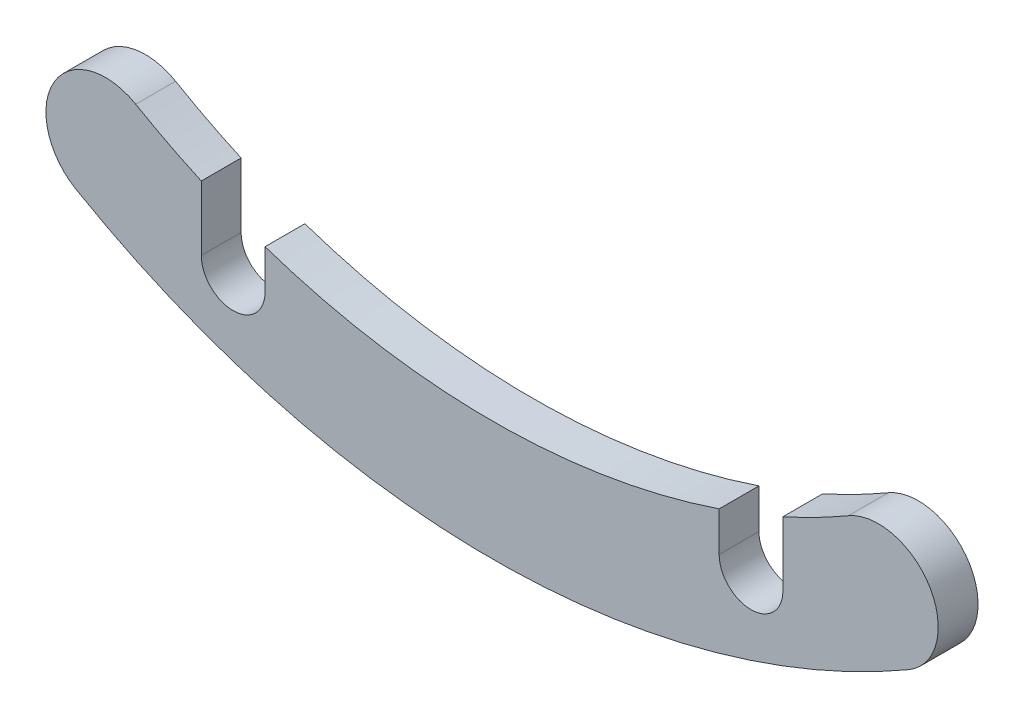
ISO-10303-21;
HEADER;
FILE_DESCRIPTION(('STEP AP214'),'2;1');
FILE_NAME('part.step','',(''),(''),'','','');
FILE_SCHEMA(('AUTOMOTIVE_DESIGN { 1 0 10303 214 1 1 1 1 }'));
ENDSEC;
DATA;
#1=APPLICATION_CONTEXT('core data for automotive mechanical design processes');
#2=APPLICATION_PROTOCOL_DEFINITION('international standard','automotive_design',2000,#1);
#3=PRODUCT_CONTEXT('',#1,'mechanical');
#4=PRODUCT('Part','Part','',(#3));
#5=PRODUCT_RELATED_PRODUCT_CATEGORY('part','',(#4));
#6=PRODUCT_DEFINITION_FORMATION('','',#4);
#7=PRODUCT_DEFINITION_CONTEXT('part definition',#1,'design');
#8=PRODUCT_DEFINITION('design','',#6,#7);
#9=PRODUCT_DEFINITION_SHAPE('','',#8);
#10=(LENGTH_UNIT() NAMED_UNIT(*) SI_UNIT(.MILLI.,.METRE.));
#11=(NAMED_UNIT(*) PLANE_ANGLE_UNIT() SI_UNIT($,.RADIAN.));
#12=(NAMED_UNIT(*) SI_UNIT($,.STERADIAN.) SOLID_ANGLE_UNIT());
#13=UNCERTAINTY_MEASURE_WITH_UNIT(LENGTH_MEASURE(1.E-05),#10,'distance_accuracy_value','');
#14=(GEOMETRIC_REPRESENTATION_CONTEXT(3) GLOBAL_UNCERTAINTY_ASSIGNED_CONTEXT((#13)) GLOBAL_UNIT_ASSIGNED_CONTEXT((#10,
#11,#12)) REPRESENTATION_CONTEXT('',''));
#15=CARTESIAN_POINT('',(0.,0.,0.));
#16=DIRECTION('',(0.,0.,1.));
#17=DIRECTION('',(1.,0.,0.));
#18=AXIS2_PLACEMENT_3D('',#15,#16,#17);
#19=CARTESIAN_POINT('',(0.,0.,-1.));
#20=DIRECTION('',(0.,0.,1.));
#21=DIRECTION('',(1.,0.,0.));
#22=AXIS2_PLACEMENT_3D('',#19,#20,#21);
#23=CYLINDRICAL_SURFACE('',#22,17.8);
#24=DIRECTION('',(0.,0.,1.));
#25=VECTOR('',#24,1.);
#26=CARTESIAN_POINT('',(5.69999999999999,-16.8626806884315,-1.));
#27=LINE('',#26,#25);
#28=CARTESIAN_POINT('',(5.69999999999999,-16.8626806884315,-1.));
#29=VERTEX_POINT('',#28);
#30=CARTESIAN_POINT('',(5.69999999999999,-16.8626806884315,0.));
#31=VERTEX_POINT('',#30);
#32=EDGE_CURVE('E156',#29,#31,#27,.T.);
#33=ORIENTED_EDGE('',*,*,#32,.F.);
#34=CARTESIAN_POINT('',(0.,0.,-1.));
#35=DIRECTION('',(0.,0.,-1.));
#36=DIRECTION('',(1.,0.,0.));
#37=AXIS2_PLACEMENT_3D('',#34,#35,#36);
#38=CIRCLE('',#37,17.8);
#39=CARTESIAN_POINT('',(-5.7,-16.8626806884315,-1.));
#40=VERTEX_POINT('',#39);
#41=EDGE_CURVE('E197',#29,#40,#38,.T.);
#42=ORIENTED_EDGE('',*,*,#41,.T.);
#43=DIRECTION('',(0.,0.,1.));
#44=VECTOR('',#43,1.);
#45=CARTESIAN_POINT('',(-5.7,-16.8626806884315,-1.));
#46=LINE('',#45,#44);
#47=CARTESIAN_POINT('',(-5.7,-16.8626806884315,0.));
#48=VERTEX_POINT('',#47);
#49=EDGE_CURVE('E175',#40,#48,#46,.T.);
#50=ORIENTED_EDGE('',*,*,#49,.T.);
#51=CARTESIAN_POINT('',(0.,0.,0.));
#52=DIRECTION('',(0.,0.,-1.));
#53=DIRECTION('',(1.,0.,0.));
#54=AXIS2_PLACEMENT_3D('',#51,#52,#53);
#55=CIRCLE('',#54,17.8);
#56=EDGE_CURVE('E208',#31,#48,#55,.T.);
#57=ORIENTED_EDGE('',*,*,#56,.F.);
#58=EDGE_LOOP('',(#33,#42,#50,#57));
#59=FACE_BOUND('',#58,.T.);
#60=ADVANCED_FACE('F33',(#59),#23,.F.);
#61=DIRECTION('',(0.,0.,1.));
#62=VECTOR('',#61,1.);
#63=CARTESIAN_POINT('',(7.29999999999999,-16.234223110454,-1.));
#64=LINE('',#63,#62);
#65=CARTESIAN_POINT('',(7.29999999999999,-16.234223110454,-1.));
#66=VERTEX_POINT('',#65);
#67=CARTESIAN_POINT('',(7.29999999999999,-16.234223110454,0.));
#68=VERTEX_POINT('',#67);
#69=EDGE_CURVE('E131',#66,#68,#64,.T.);
#70=ORIENTED_EDGE('',*,*,#69,.T.);
#71=CARTESIAN_POINT('',(8.94611398963731,-15.3885361384511,0.));
#72=VERTEX_POINT('',#71);
#73=EDGE_CURVE('E188',#72,#68,#55,.T.);
#74=ORIENTED_EDGE('',*,*,#73,.F.);
#75=DIRECTION('',(0.,0.,1.));
#76=VECTOR('',#75,1.);
#77=CARTESIAN_POINT('',(8.94611398963731,-15.3885361384511,-1.));
#78=LINE('',#77,#76);
#79=CARTESIAN_POINT('',(8.94611398963731,-15.3885361384511,-1.));
#80=VERTEX_POINT('',#79);
#81=EDGE_CURVE('E42',#80,#72,#78,.T.);
#82=ORIENTED_EDGE('',*,*,#81,.F.);
#83=EDGE_CURVE('E195',#80,#66,#38,.T.);
#84=ORIENTED_EDGE('',*,*,#83,.T.);
#85=EDGE_LOOP('',(#70,#74,#82,#84));
#86=FACE_BOUND('',#85,.T.);
#87=ADVANCED_FACE('F233',(#86),#23,.F.);
#88=CARTESIAN_POINT('',(-9.7,-16.6853228916914,-1.));
#89=DIRECTION('',(0.,0.,1.));
#90=DIRECTION('',(1.,0.,0.));
#91=AXIS2_PLACEMENT_3D('',#88,#89,#90);
#92=CYLINDRICAL_SURFACE('',#91,1.5);
#93=CARTESIAN_POINT('',(-9.7,-16.6853228916914,0.));
#94=DIRECTION('',(0.,0.,1.));
#95=DIRECTION('',(1.,0.,0.));
#96=AXIS2_PLACEMENT_3D('',#93,#94,#95);
#97=CIRCLE('',#96,1.5);
#98=CARTESIAN_POINT('',(-8.94611398963732,-15.3885361384511,0.));
#99=VERTEX_POINT('',#98);
#100=CARTESIAN_POINT('',(-10.4538860103627,-17.9821096449316,0.));
#101=VERTEX_POINT('',#100);
#102=EDGE_CURVE('E178',#99,#101,#97,.T.);
#103=ORIENTED_EDGE('',*,*,#102,.F.);
#104=DIRECTION('',(0.,0.,1.));
#105=VECTOR('',#104,1.);
#106=CARTESIAN_POINT('',(-8.94611398963732,-15.3885361384511,-1.));
#107=LINE('',#106,#105);
#108=CARTESIAN_POINT('',(-8.94611398963732,-15.3885361384511,-1.));
#109=VERTEX_POINT('',#108);
#110=EDGE_CURVE('E11',#109,#99,#107,.T.);
#111=ORIENTED_EDGE('',*,*,#110,.F.);
#112=CARTESIAN_POINT('',(-9.7,-16.6853228916914,-1.));
#113=DIRECTION('',(0.,0.,1.));
#114=DIRECTION('',(1.,0.,0.));
#115=AXIS2_PLACEMENT_3D('',#112,#113,#114);
#116=CIRCLE('',#115,1.5);
#117=CARTESIAN_POINT('',(-10.4538860103627,-17.9821096449316,-1.));
#118=VERTEX_POINT('',#117);
#119=EDGE_CURVE('E184',#109,#118,#116,.T.);
#120=ORIENTED_EDGE('',*,*,#119,.T.);
#121=DIRECTION('',(0.,0.,1.));
#122=VECTOR('',#121,1.);
#123=CARTESIAN_POINT('',(-10.4538860103627,-17.9821096449316,-1.));
#124=LINE('',#123,#122);
#125=EDGE_CURVE('E37',#118,#101,#124,.T.);
#126=ORIENTED_EDGE('',*,*,#125,.T.);
#127=EDGE_LOOP('',(#103,#111,#120,#126));
#128=FACE_BOUND('',#127,.T.);
#129=ADVANCED_FACE('F35',(#128),#92,.T.);
#130=DIRECTION('',(0.,0.,1.));
#131=VECTOR('',#130,1.);
#132=CARTESIAN_POINT('',(-7.3,-16.234223110454,-1.));
#133=LINE('',#132,#131);
#134=CARTESIAN_POINT('',(-7.3,-16.234223110454,-1.));
#135=VERTEX_POINT('',#134);
#136=CARTESIAN_POINT('',(-7.3,-16.234223110454,0.));
#137=VERTEX_POINT('',#136);
#138=EDGE_CURVE('E58',#135,#137,#133,.T.);
#139=ORIENTED_EDGE('',*,*,#138,.F.);
#140=EDGE_CURVE('E194',#135,#109,#38,.T.);
#141=ORIENTED_EDGE('',*,*,#140,.T.);
#142=ORIENTED_EDGE('',*,*,#110,.T.);
#143=EDGE_CURVE('E206',#137,#99,#55,.T.);
#144=ORIENTED_EDGE('',*,*,#143,.F.);
#145=EDGE_LOOP('',(#139,#141,#142,#144));
#146=FACE_BOUND('',#145,.T.);
#147=ADVANCED_FACE('F226',(#146),#23,.F.);
#148=CARTESIAN_POINT('',(9.7,-16.6853228916914,-1.));
#149=DIRECTION('',(0.,0.,1.));
#150=DIRECTION('',(1.,0.,0.));
#151=AXIS2_PLACEMENT_3D('',#148,#149,#150);
#152=CYLINDRICAL_SURFACE('',#151,1.5);
#153=CARTESIAN_POINT('',(9.7,-16.6853228916914,0.));
#154=DIRECTION('',(0.,0.,1.));
#155=DIRECTION('',(-1.,0.,0.));
#156=AXIS2_PLACEMENT_3D('',#153,#154,#155);
#157=CIRCLE('',#156,1.5);
#158=CARTESIAN_POINT('',(10.4538860103627,-17.9821096449316,0.));
#159=VERTEX_POINT('',#158);
#160=EDGE_CURVE('E203',#159,#72,#157,.T.);
#161=ORIENTED_EDGE('',*,*,#160,.F.);
#162=DIRECTION('',(0.,0.,1.));
#163=VECTOR('',#162,1.);
#164=CARTESIAN_POINT('',(10.4538860103627,-17.9821096449316,-1.));
#165=LINE('',#164,#163);
#166=CARTESIAN_POINT('',(10.4538860103627,-17.9821096449316,-1.));
#167=VERTEX_POINT('',#166);
#168=EDGE_CURVE('E210',#167,#159,#165,.T.);
#169=ORIENTED_EDGE('',*,*,#168,.F.);
#170=CARTESIAN_POINT('',(9.7,-16.6853228916914,-1.));
#171=DIRECTION('',(0.,0.,1.));
#172=DIRECTION('',(-1.,0.,0.));
#173=AXIS2_PLACEMENT_3D('',#170,#171,#172);
#174=CIRCLE('',#173,1.5);
#175=EDGE_CURVE('E191',#167,#80,#174,.T.);
#176=ORIENTED_EDGE('',*,*,#175,.T.);
#177=ORIENTED_EDGE('',*,*,#81,.T.);
#178=EDGE_LOOP('',(#161,#169,#176,#177));
#179=FACE_BOUND('',#178,.T.);
#180=ADVANCED_FACE('F230',(#179),#152,.T.);
#181=CARTESIAN_POINT('',(0.,0.,-1.));
#182=DIRECTION('',(0.,0.,1.));
#183=DIRECTION('',(1.,0.,0.));
#184=AXIS2_PLACEMENT_3D('',#181,#182,#183);
#185=CYLINDRICAL_SURFACE('',#184,20.8);
#186=CARTESIAN_POINT('',(0.,0.,0.));
#187=DIRECTION('',(0.,0.,1.));
#188=DIRECTION('',(1.,0.,0.));
#189=AXIS2_PLACEMENT_3D('',#186,#187,#188);
#190=CIRCLE('',#189,20.8);
#191=EDGE_CURVE('E200',#101,#159,#190,.T.);
#192=ORIENTED_EDGE('',*,*,#191,.F.);
#193=ORIENTED_EDGE('',*,*,#125,.F.);
#194=CARTESIAN_POINT('',(0.,0.,-1.));
#195=DIRECTION('',(0.,0.,1.));
#196=DIRECTION('',(1.,0.,0.));
#197=AXIS2_PLACEMENT_3D('',#194,#195,#196);
#198=CIRCLE('',#197,20.8);
#199=EDGE_CURVE('E187',#118,#167,#198,.T.);
#200=ORIENTED_EDGE('',*,*,#199,.T.);
#201=ORIENTED_EDGE('',*,*,#168,.T.);
#202=EDGE_LOOP('',(#192,#193,#200,#201));
#203=FACE_BOUND('',#202,.T.);
#204=ADVANCED_FACE('F219',(#203),#185,.T.);
#205=CARTESIAN_POINT('',(-4.85,-8.34266144584569,-1.));
#206=DIRECTION('',(0.,0.,1.));
#207=DIRECTION('',(1.,0.,0.));
#208=AXIS2_PLACEMENT_3D('',#205,#206,#207);
#209=PLANE('',#208);
#210=ORIENTED_EDGE('',*,*,#41,.F.);
#211=DIRECTION('',(0.,-1.,0.));
#212=VECTOR('',#211,1.);
#213=CARTESIAN_POINT('',(5.7,-17.8535710713571,-1.));
#214=LINE('',#213,#212);
#215=CARTESIAN_POINT('',(5.7,-17.8535710713571,-1.));
#216=VERTEX_POINT('',#215);
#217=EDGE_CURVE('E132',#29,#216,#214,.T.);
#218=ORIENTED_EDGE('',*,*,#217,.T.);
#219=CARTESIAN_POINT('',(6.5,-17.8535710713571,-1.));
#220=DIRECTION('',(0.,0.,1.));
#221=DIRECTION('',(-1.,0.,0.));
#222=AXIS2_PLACEMENT_3D('',#219,#220,#221);
#223=CIRCLE('',#222,0.8);
#224=CARTESIAN_POINT('',(7.3,-17.8535710713571,-1.));
#225=VERTEX_POINT('',#224);
#226=EDGE_CURVE('E127',#216,#225,#223,.T.);
#227=ORIENTED_EDGE('',*,*,#226,.T.);
#228=DIRECTION('',(0.,1.,0.));
#229=VECTOR('',#228,1.);
#230=CARTESIAN_POINT('',(7.3,-17.8535710713571,-1.));
#231=LINE('',#230,#229);
#232=EDGE_CURVE('E135',#225,#66,#231,.T.);
#233=ORIENTED_EDGE('',*,*,#232,.T.);
#234=ORIENTED_EDGE('',*,*,#83,.F.);
#235=ORIENTED_EDGE('',*,*,#175,.F.);
#236=ORIENTED_EDGE('',*,*,#199,.F.);
#237=ORIENTED_EDGE('',*,*,#119,.F.);
#238=ORIENTED_EDGE('',*,*,#140,.F.);
#239=DIRECTION('',(0.,-1.,0.));
#240=VECTOR('',#239,1.);
#241=CARTESIAN_POINT('',(-7.3,-17.8535710713571,-1.));
#242=LINE('',#241,#240);
#243=CARTESIAN_POINT('',(-7.3,-17.8535710713571,-1.));
#244=VERTEX_POINT('',#243);
#245=EDGE_CURVE('E159',#135,#244,#242,.T.);
#246=ORIENTED_EDGE('',*,*,#245,.T.);
#247=CARTESIAN_POINT('',(-6.5,-17.8535710713571,-1.));
#248=DIRECTION('',(0.,0.,1.));
#249=DIRECTION('',(1.,0.,0.));
#250=AXIS2_PLACEMENT_3D('',#247,#248,#249);
#251=CIRCLE('',#250,0.8);
#252=CARTESIAN_POINT('',(-5.7,-17.8535710713571,-1.));
#253=VERTEX_POINT('',#252);
#254=EDGE_CURVE('E162',#244,#253,#251,.T.);
#255=ORIENTED_EDGE('',*,*,#254,.T.);
#256=DIRECTION('',(0.,1.,0.));
#257=VECTOR('',#256,1.);
#258=CARTESIAN_POINT('',(-5.7,-17.8535710713571,-1.));
#259=LINE('',#258,#257);
#260=EDGE_CURVE('E166',#253,#40,#259,.T.);
#261=ORIENTED_EDGE('',*,*,#260,.T.);
#262=EDGE_LOOP('',(#210,#218,#227,#233,#234,#235,#236,#237,#238,#246,#255,#261));
#263=FACE_BOUND('',#262,.T.);
#264=ADVANCED_FACE('F143',(#263),#209,.F.);
#265=CARTESIAN_POINT('',(-4.85,-8.34266144584569,0.));
#266=DIRECTION('',(0.,0.,1.));
#267=DIRECTION('',(1.,0.,0.));
#268=AXIS2_PLACEMENT_3D('',#265,#266,#267);
#269=PLANE('',#268);
#270=DIRECTION('',(0.,-1.,0.));
#271=VECTOR('',#270,1.);
#272=CARTESIAN_POINT('',(5.7,-17.8535710713571,0.));
#273=LINE('',#272,#271);
#274=CARTESIAN_POINT('',(5.7,-17.8535710713571,0.));
#275=VERTEX_POINT('',#274);
#276=EDGE_CURVE('E144',#31,#275,#273,.T.);
#277=ORIENTED_EDGE('',*,*,#276,.F.);
#278=ORIENTED_EDGE('',*,*,#56,.T.);
#279=DIRECTION('',(0.,1.,0.));
#280=VECTOR('',#279,1.);
#281=CARTESIAN_POINT('',(-5.7,-17.8535710713571,0.));
#282=LINE('',#281,#280);
#283=CARTESIAN_POINT('',(-5.7,-17.8535710713571,0.));
#284=VERTEX_POINT('',#283);
#285=EDGE_CURVE('E163',#284,#48,#282,.T.);
#286=ORIENTED_EDGE('',*,*,#285,.F.);
#287=CARTESIAN_POINT('',(-6.5,-17.8535710713571,0.));
#288=DIRECTION('',(0.,0.,1.));
#289=DIRECTION('',(1.,0.,0.));
#290=AXIS2_PLACEMENT_3D('',#287,#288,#289);
#291=CIRCLE('',#290,0.8);
#292=CARTESIAN_POINT('',(-7.3,-17.8535710713571,0.));
#293=VERTEX_POINT('',#292);
#294=EDGE_CURVE('E170',#293,#284,#291,.T.);
#295=ORIENTED_EDGE('',*,*,#294,.F.);
#296=DIRECTION('',(0.,-1.,0.));
#297=VECTOR('',#296,1.);
#298=CARTESIAN_POINT('',(-7.3,-17.8535710713571,0.));
#299=LINE('',#298,#297);
#300=EDGE_CURVE('E155',#137,#293,#299,.T.);
#301=ORIENTED_EDGE('',*,*,#300,.F.);
#302=ORIENTED_EDGE('',*,*,#143,.T.);
#303=ORIENTED_EDGE('',*,*,#102,.T.);
#304=ORIENTED_EDGE('',*,*,#191,.T.);
#305=ORIENTED_EDGE('',*,*,#160,.T.);
#306=ORIENTED_EDGE('',*,*,#73,.T.);
#307=DIRECTION('',(0.,1.,0.));
#308=VECTOR('',#307,1.);
#309=CARTESIAN_POINT('',(7.3,-17.8535710713571,0.));
#310=LINE('',#309,#308);
#311=CARTESIAN_POINT('',(7.3,-17.8535710713571,0.));
#312=VERTEX_POINT('',#311);
#313=EDGE_CURVE('E147',#312,#68,#310,.T.);
#314=ORIENTED_EDGE('',*,*,#313,.F.);
#315=CARTESIAN_POINT('',(6.5,-17.8535710713571,0.));
#316=DIRECTION('',(0.,0.,1.));
#317=DIRECTION('',(-1.,0.,0.));
#318=AXIS2_PLACEMENT_3D('',#315,#316,#317);
#319=CIRCLE('',#318,0.8);
#320=EDGE_CURVE('E50',#275,#312,#319,.T.);
#321=ORIENTED_EDGE('',*,*,#320,.F.);
#322=EDGE_LOOP('',(#277,#278,#286,#295,#301,#302,#303,#304,#305,#306,#314,#321));
#323=FACE_BOUND('',#322,.T.);
#324=ADVANCED_FACE('F222',(#323),#269,.T.);
#325=CARTESIAN_POINT('',(-5.7,-17.8535710713571,-1.));
#326=DIRECTION('',(1.,0.,0.));
#327=DIRECTION('',(0.,0.,-1.));
#328=AXIS2_PLACEMENT_3D('',#325,#326,#327);
#329=PLANE('',#328);
#330=ORIENTED_EDGE('',*,*,#285,.T.);
#331=ORIENTED_EDGE('',*,*,#49,.F.);
#332=ORIENTED_EDGE('',*,*,#260,.F.);
#333=DIRECTION('',(0.,0.,1.));
#334=VECTOR('',#333,1.);
#335=CARTESIAN_POINT('',(-5.7,-17.8535710713571,-1.));
#336=LINE('',#335,#334);
#337=EDGE_CURVE('E179',#253,#284,#336,.T.);
#338=ORIENTED_EDGE('',*,*,#337,.T.);
#339=EDGE_LOOP('',(#330,#331,#332,#338));
#340=FACE_BOUND('',#339,.T.);
#341=ADVANCED_FACE('F257',(#340),#329,.F.);
#342=CARTESIAN_POINT('',(-6.5,-17.8535710713571,-1.));
#343=DIRECTION('',(0.,0.,1.));
#344=DIRECTION('',(1.,0.,0.));
#345=AXIS2_PLACEMENT_3D('',#342,#343,#344);
#346=CYLINDRICAL_SURFACE('',#345,0.8);
#347=ORIENTED_EDGE('',*,*,#294,.T.);
#348=ORIENTED_EDGE('',*,*,#337,.F.);
#349=ORIENTED_EDGE('',*,*,#254,.F.);
#350=DIRECTION('',(0.,0.,1.));
#351=VECTOR('',#350,1.);
#352=CARTESIAN_POINT('',(-7.3,-17.8535710713571,-1.));
#353=LINE('',#352,#351);
#354=EDGE_CURVE('E181',#244,#293,#353,.T.);
#355=ORIENTED_EDGE('',*,*,#354,.T.);
#356=EDGE_LOOP('',(#347,#348,#349,#355));
#357=FACE_BOUND('',#356,.T.);
#358=ADVANCED_FACE('F262',(#357),#346,.F.);
#359=CARTESIAN_POINT('',(-7.3,-17.8535710713571,-1.));
#360=DIRECTION('',(-1.,0.,0.));
#361=DIRECTION('',(0.,-1.,0.));
#362=AXIS2_PLACEMENT_3D('',#359,#360,#361);
#363=PLANE('',#362);
#364=ORIENTED_EDGE('',*,*,#300,.T.);
#365=ORIENTED_EDGE('',*,*,#354,.F.);
#366=ORIENTED_EDGE('',*,*,#245,.F.);
#367=ORIENTED_EDGE('',*,*,#138,.T.);
#368=EDGE_LOOP('',(#364,#365,#366,#367));
#369=FACE_BOUND('',#368,.T.);
#370=ADVANCED_FACE('F259',(#369),#363,.F.);
#371=CARTESIAN_POINT('',(6.5,-17.8535710713571,-1.));
#372=DIRECTION('',(0.,0.,1.));
#373=DIRECTION('',(1.,0.,0.));
#374=AXIS2_PLACEMENT_3D('',#371,#372,#373);
#375=CYLINDRICAL_SURFACE('',#374,0.8);
#376=ORIENTED_EDGE('',*,*,#320,.T.);
#377=DIRECTION('',(0.,0.,1.));
#378=VECTOR('',#377,1.);
#379=CARTESIAN_POINT('',(7.3,-17.8535710713571,-1.));
#380=LINE('',#379,#378);
#381=EDGE_CURVE('E123',#225,#312,#380,.T.);
#382=ORIENTED_EDGE('',*,*,#381,.F.);
#383=ORIENTED_EDGE('',*,*,#226,.F.);
#384=DIRECTION('',(0.,0.,1.));
#385=VECTOR('',#384,1.);
#386=CARTESIAN_POINT('',(5.7,-17.8535710713571,-1.));
#387=LINE('',#386,#385);
#388=EDGE_CURVE('E153',#216,#275,#387,.T.);
#389=ORIENTED_EDGE('',*,*,#388,.T.);
#390=EDGE_LOOP('',(#376,#382,#383,#389));
#391=FACE_BOUND('',#390,.T.);
#392=ADVANCED_FACE('F125',(#391),#375,.F.);
#393=CARTESIAN_POINT('',(5.7,-17.8535710713571,-1.));
#394=DIRECTION('',(-1.,0.,0.));
#395=DIRECTION('',(0.,-1.,0.));
#396=AXIS2_PLACEMENT_3D('',#393,#394,#395);
#397=PLANE('',#396);
#398=ORIENTED_EDGE('',*,*,#276,.T.);
#399=ORIENTED_EDGE('',*,*,#388,.F.);
#400=ORIENTED_EDGE('',*,*,#217,.F.);
#401=ORIENTED_EDGE('',*,*,#32,.T.);
#402=EDGE_LOOP('',(#398,#399,#400,#401));
#403=FACE_BOUND('',#402,.T.);
#404=ADVANCED_FACE('F271',(#403),#397,.F.);
#405=CARTESIAN_POINT('',(7.3,-17.8535710713571,-1.));
#406=DIRECTION('',(1.,0.,0.));
#407=DIRECTION('',(0.,1.,0.));
#408=AXIS2_PLACEMENT_3D('',#405,#406,#407);
#409=PLANE('',#408);
#410=ORIENTED_EDGE('',*,*,#313,.T.);
#411=ORIENTED_EDGE('',*,*,#69,.F.);
#412=ORIENTED_EDGE('',*,*,#232,.F.);
#413=ORIENTED_EDGE('',*,*,#381,.T.);
#414=EDGE_LOOP('',(#410,#411,#412,#413));
#415=FACE_BOUND('',#414,.T.);
#416=ADVANCED_FACE('F136',(#415),#409,.F.);
#417=CLOSED_SHELL('',(#60,#87,#129,#147,#180,#204,#264,#324,#341,#358,#370,#392,#404,#416));
#418=MANIFOLD_SOLID_BREP('B2',#417);
#419=ADVANCED_BREP_SHAPE_REPRESENTATION('',(#18,#418),#14);
#420=SHAPE_DEFINITION_REPRESENTATION(#9,#419);
ENDSEC;
END-ISO-10303-21;
